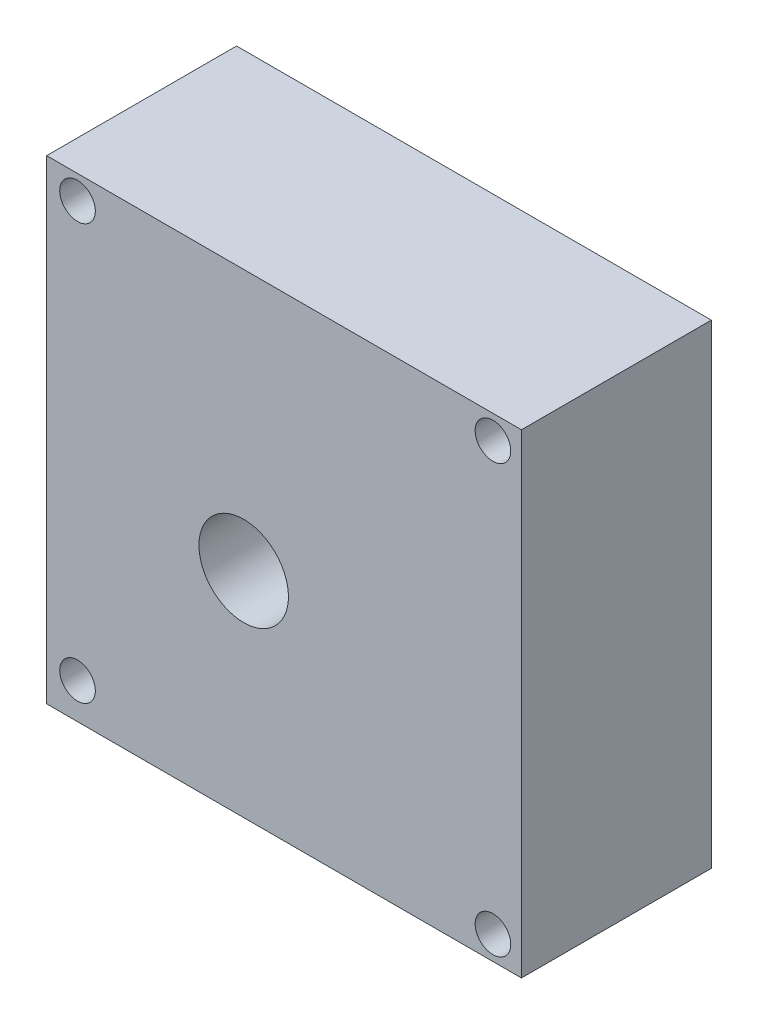
ISO-10303-21;
HEADER;
FILE_DESCRIPTION(('STEP AP214'),'2;1');
FILE_NAME('part.step','',(''),(''),'','','');
FILE_SCHEMA(('AUTOMOTIVE_DESIGN { 1 0 10303 214 1 1 1 1 }'));
ENDSEC;
DATA;
#1=APPLICATION_CONTEXT('core data for automotive mechanical design processes');
#2=APPLICATION_PROTOCOL_DEFINITION('international standard','automotive_design',2000,#1);
#3=PRODUCT_CONTEXT('',#1,'mechanical');
#4=PRODUCT('Part','Part','',(#3));
#5=PRODUCT_RELATED_PRODUCT_CATEGORY('part','',(#4));
#6=PRODUCT_DEFINITION_FORMATION('','',#4);
#7=PRODUCT_DEFINITION_CONTEXT('part definition',#1,'design');
#8=PRODUCT_DEFINITION('design','',#6,#7);
#9=PRODUCT_DEFINITION_SHAPE('','',#8);
#10=(LENGTH_UNIT() NAMED_UNIT(*) SI_UNIT(.MILLI.,.METRE.));
#11=(NAMED_UNIT(*) PLANE_ANGLE_UNIT() SI_UNIT($,.RADIAN.));
#12=(NAMED_UNIT(*) SI_UNIT($,.STERADIAN.) SOLID_ANGLE_UNIT());
#13=UNCERTAINTY_MEASURE_WITH_UNIT(LENGTH_MEASURE(1.E-05),#10,'distance_accuracy_value','');
#14=(GEOMETRIC_REPRESENTATION_CONTEXT(3) GLOBAL_UNCERTAINTY_ASSIGNED_CONTEXT((#13)) GLOBAL_UNIT_ASSIGNED_CONTEXT((#10,
#11,#12)) REPRESENTATION_CONTEXT('',''));
#15=CARTESIAN_POINT('',(0.,0.,0.));
#16=DIRECTION('',(0.,0.,1.));
#17=DIRECTION('',(1.,0.,0.));
#18=AXIS2_PLACEMENT_3D('',#15,#16,#17);
#19=CARTESIAN_POINT('',(0.,0.,0.));
#20=DIRECTION('',(0.,0.,-1.));
#21=DIRECTION('',(-1.,0.,0.));
#22=AXIS2_PLACEMENT_3D('',#19,#20,#21);
#23=PLANE('',#22);
#24=CARTESIAN_POINT('',(47.752,2.54,0.));
#25=DIRECTION('',(0.,0.,-1.));
#26=DIRECTION('',(-1.,0.,0.));
#27=AXIS2_PLACEMENT_3D('',#24,#25,#26);
#28=CIRCLE('',#27,1.905);
#29=CARTESIAN_POINT('',(45.847,2.54,0.));
#30=VERTEX_POINT('',#29);
#31=EDGE_CURVE('E147',#30,#30,#28,.F.);
#32=ORIENTED_EDGE('',*,*,#31,.T.);
#33=EDGE_LOOP('',(#32));
#34=FACE_BOUND('',#33,.T.);
#35=CARTESIAN_POINT('',(3.302,48.26,0.));
#36=DIRECTION('',(0.,0.,-1.));
#37=DIRECTION('',(-1.,0.,0.));
#38=AXIS2_PLACEMENT_3D('',#35,#36,#37);
#39=CIRCLE('',#38,1.905);
#40=CARTESIAN_POINT('',(1.397,48.26,0.));
#41=VERTEX_POINT('',#40);
#42=EDGE_CURVE('E269',#41,#41,#39,.F.);
#43=ORIENTED_EDGE('',*,*,#42,.T.);
#44=EDGE_LOOP('',(#43));
#45=FACE_BOUND('',#44,.T.);
#46=CARTESIAN_POINT('',(3.30199999999999,3.81,0.));
#47=DIRECTION('',(0.,0.,-1.));
#48=DIRECTION('',(-1.,0.,0.));
#49=AXIS2_PLACEMENT_3D('',#46,#47,#48);
#50=CIRCLE('',#49,1.905);
#51=CARTESIAN_POINT('',(1.39699999999999,3.81,0.));
#52=VERTEX_POINT('',#51);
#53=EDGE_CURVE('E267',#52,#52,#50,.F.);
#54=ORIENTED_EDGE('',*,*,#53,.T.);
#55=EDGE_LOOP('',(#54));
#56=FACE_BOUND('',#55,.T.);
#57=CARTESIAN_POINT('',(47.752,48.26,0.));
#58=DIRECTION('',(0.,0.,-1.));
#59=DIRECTION('',(-1.,0.,0.));
#60=AXIS2_PLACEMENT_3D('',#57,#58,#59);
#61=CIRCLE('',#60,1.905);
#62=CARTESIAN_POINT('',(45.847,48.26,0.));
#63=VERTEX_POINT('',#62);
#64=EDGE_CURVE('E264',#63,#63,#61,.F.);
#65=ORIENTED_EDGE('',*,*,#64,.T.);
#66=EDGE_LOOP('',(#65));
#67=FACE_BOUND('',#66,.T.);
#68=DIRECTION('',(0.,-1.,0.));
#69=VECTOR('',#68,1.);
#70=CARTESIAN_POINT('',(0.,0.,0.));
#71=LINE('',#70,#69);
#72=CARTESIAN_POINT('',(0.,50.8,0.));
#73=VERTEX_POINT('',#72);
#74=CARTESIAN_POINT('',(0.,0.,0.));
#75=VERTEX_POINT('',#74);
#76=EDGE_CURVE('E138',#73,#75,#71,.T.);
#77=ORIENTED_EDGE('',*,*,#76,.F.);
#78=DIRECTION('',(-1.,0.,0.));
#79=VECTOR('',#78,1.);
#80=CARTESIAN_POINT('',(0.,50.8,0.));
#81=LINE('',#80,#79);
#82=CARTESIAN_POINT('',(50.8,50.8,0.));
#83=VERTEX_POINT('',#82);
#84=EDGE_CURVE('E86',#83,#73,#81,.T.);
#85=ORIENTED_EDGE('',*,*,#84,.F.);
#86=DIRECTION('',(0.,1.,0.));
#87=VECTOR('',#86,1.);
#88=CARTESIAN_POINT('',(50.8,0.,0.));
#89=LINE('',#88,#87);
#90=CARTESIAN_POINT('',(50.8,0.,0.));
#91=VERTEX_POINT('',#90);
#92=EDGE_CURVE('E169',#91,#83,#89,.T.);
#93=ORIENTED_EDGE('',*,*,#92,.F.);
#94=DIRECTION('',(1.,0.,0.));
#95=VECTOR('',#94,1.);
#96=CARTESIAN_POINT('',(0.,0.,0.));
#97=LINE('',#96,#95);
#98=EDGE_CURVE('E142',#75,#91,#97,.T.);
#99=ORIENTED_EDGE('',*,*,#98,.F.);
#100=EDGE_LOOP('',(#77,#85,#93,#99));
#101=FACE_BOUND('',#100,.T.);
#102=DIRECTION('',(-1.,0.,0.));
#103=VECTOR('',#102,1.);
#104=CARTESIAN_POINT('',(0.,43.18,0.));
#105=LINE('',#104,#103);
#106=CARTESIAN_POINT('',(43.18,43.18,0.));
#107=VERTEX_POINT('',#106);
#108=CARTESIAN_POINT('',(7.62,43.18,0.));
#109=VERTEX_POINT('',#108);
#110=EDGE_CURVE('E133',#107,#109,#105,.T.);
#111=ORIENTED_EDGE('',*,*,#110,.T.);
#112=DIRECTION('',(0.,-1.,0.));
#113=VECTOR('',#112,1.);
#114=CARTESIAN_POINT('',(7.62,0.,0.));
#115=LINE('',#114,#113);
#116=CARTESIAN_POINT('',(7.62,7.62,0.));
#117=VERTEX_POINT('',#116);
#118=EDGE_CURVE('E155',#109,#117,#115,.T.);
#119=ORIENTED_EDGE('',*,*,#118,.T.);
#120=DIRECTION('',(1.,0.,0.));
#121=VECTOR('',#120,1.);
#122=CARTESIAN_POINT('',(0.,7.62,0.));
#123=LINE('',#122,#121);
#124=CARTESIAN_POINT('',(43.18,7.62,0.));
#125=VERTEX_POINT('',#124);
#126=EDGE_CURVE('E137',#117,#125,#123,.T.);
#127=ORIENTED_EDGE('',*,*,#126,.T.);
#128=DIRECTION('',(0.,1.,0.));
#129=VECTOR('',#128,1.);
#130=CARTESIAN_POINT('',(43.18,0.,0.));
#131=LINE('',#130,#129);
#132=EDGE_CURVE('E56',#125,#107,#131,.T.);
#133=ORIENTED_EDGE('',*,*,#132,.T.);
#134=EDGE_LOOP('',(#111,#119,#127,#133));
#135=FACE_BOUND('',#134,.T.);
#136=ADVANCED_FACE('F41',(#34,#45,#56,#67,#101,#135),#23,.T.);
#137=CARTESIAN_POINT('',(0.,0.,20.32));
#138=DIRECTION('',(1.,0.,0.));
#139=DIRECTION('',(0.,0.,-1.));
#140=AXIS2_PLACEMENT_3D('',#137,#138,#139);
#141=PLANE('',#140);
#142=ORIENTED_EDGE('',*,*,#76,.T.);
#143=DIRECTION('',(0.,0.,-1.));
#144=VECTOR('',#143,1.);
#145=CARTESIAN_POINT('',(0.,0.,20.32));
#146=LINE('',#145,#144);
#147=CARTESIAN_POINT('',(0.,0.,20.32));
#148=VERTEX_POINT('',#147);
#149=EDGE_CURVE('E11',#148,#75,#146,.T.);
#150=ORIENTED_EDGE('',*,*,#149,.F.);
#151=DIRECTION('',(0.,-1.,0.));
#152=VECTOR('',#151,1.);
#153=CARTESIAN_POINT('',(0.,0.,20.32));
#154=LINE('',#153,#152);
#155=CARTESIAN_POINT('',(0.,50.8,20.32));
#156=VERTEX_POINT('',#155);
#157=EDGE_CURVE('E161',#156,#148,#154,.T.);
#158=ORIENTED_EDGE('',*,*,#157,.F.);
#159=DIRECTION('',(0.,0.,-1.));
#160=VECTOR('',#159,1.);
#161=CARTESIAN_POINT('',(0.,50.8,20.32));
#162=LINE('',#161,#160);
#163=EDGE_CURVE('E166',#156,#73,#162,.T.);
#164=ORIENTED_EDGE('',*,*,#163,.T.);
#165=EDGE_LOOP('',(#142,#150,#158,#164));
#166=FACE_BOUND('',#165,.T.);
#167=ADVANCED_FACE('F43',(#166),#141,.F.);
#168=CARTESIAN_POINT('',(0.,0.,20.32));
#169=DIRECTION('',(0.,1.,0.));
#170=DIRECTION('',(0.,0.,1.));
#171=AXIS2_PLACEMENT_3D('',#168,#169,#170);
#172=PLANE('',#171);
#173=ORIENTED_EDGE('',*,*,#98,.T.);
#174=DIRECTION('',(0.,0.,-1.));
#175=VECTOR('',#174,1.);
#176=CARTESIAN_POINT('',(50.8,0.,20.32));
#177=LINE('',#176,#175);
#178=CARTESIAN_POINT('',(50.8,0.,20.32));
#179=VERTEX_POINT('',#178);
#180=EDGE_CURVE('E49',#179,#91,#177,.T.);
#181=ORIENTED_EDGE('',*,*,#180,.F.);
#182=DIRECTION('',(1.,0.,0.));
#183=VECTOR('',#182,1.);
#184=CARTESIAN_POINT('',(0.,0.,20.32));
#185=LINE('',#184,#183);
#186=EDGE_CURVE('E93',#148,#179,#185,.T.);
#187=ORIENTED_EDGE('',*,*,#186,.F.);
#188=ORIENTED_EDGE('',*,*,#149,.T.);
#189=EDGE_LOOP('',(#173,#181,#187,#188));
#190=FACE_BOUND('',#189,.T.);
#191=ADVANCED_FACE('F197',(#190),#172,.F.);
#192=CARTESIAN_POINT('',(50.8,0.,20.32));
#193=DIRECTION('',(-1.,0.,0.));
#194=DIRECTION('',(0.,0.,1.));
#195=AXIS2_PLACEMENT_3D('',#192,#193,#194);
#196=PLANE('',#195);
#197=ORIENTED_EDGE('',*,*,#92,.T.);
#198=DIRECTION('',(0.,0.,-1.));
#199=VECTOR('',#198,1.);
#200=CARTESIAN_POINT('',(50.8,50.8,20.32));
#201=LINE('',#200,#199);
#202=CARTESIAN_POINT('',(50.8,50.8,20.32));
#203=VERTEX_POINT('',#202);
#204=EDGE_CURVE('E173',#203,#83,#201,.T.);
#205=ORIENTED_EDGE('',*,*,#204,.F.);
#206=DIRECTION('',(0.,1.,0.));
#207=VECTOR('',#206,1.);
#208=CARTESIAN_POINT('',(50.8,0.,20.32));
#209=LINE('',#208,#207);
#210=EDGE_CURVE('E164',#179,#203,#209,.T.);
#211=ORIENTED_EDGE('',*,*,#210,.F.);
#212=ORIENTED_EDGE('',*,*,#180,.T.);
#213=EDGE_LOOP('',(#197,#205,#211,#212));
#214=FACE_BOUND('',#213,.T.);
#215=ADVANCED_FACE('F178',(#214),#196,.F.);
#216=CARTESIAN_POINT('',(0.,50.8,20.32));
#217=DIRECTION('',(0.,-1.,0.));
#218=DIRECTION('',(0.,0.,-1.));
#219=AXIS2_PLACEMENT_3D('',#216,#217,#218);
#220=PLANE('',#219);
#221=ORIENTED_EDGE('',*,*,#84,.T.);
#222=ORIENTED_EDGE('',*,*,#163,.F.);
#223=DIRECTION('',(-1.,0.,0.));
#224=VECTOR('',#223,1.);
#225=CARTESIAN_POINT('',(0.,50.8,20.32));
#226=LINE('',#225,#224);
#227=EDGE_CURVE('E65',#203,#156,#226,.T.);
#228=ORIENTED_EDGE('',*,*,#227,.F.);
#229=ORIENTED_EDGE('',*,*,#204,.T.);
#230=EDGE_LOOP('',(#221,#222,#228,#229));
#231=FACE_BOUND('',#230,.T.);
#232=ADVANCED_FACE('F186',(#231),#220,.F.);
#233=CARTESIAN_POINT('',(0.,0.,20.32));
#234=DIRECTION('',(0.,0.,-1.));
#235=DIRECTION('',(-1.,0.,0.));
#236=AXIS2_PLACEMENT_3D('',#233,#234,#235);
#237=PLANE('',#236);
#238=CARTESIAN_POINT('',(21.082,22.86,20.32));
#239=DIRECTION('',(0.,0.,-1.));
#240=DIRECTION('',(-1.,0.,0.));
#241=AXIS2_PLACEMENT_3D('',#238,#239,#240);
#242=CIRCLE('',#241,4.7879);
#243=CARTESIAN_POINT('',(16.2941,22.86,20.32));
#244=VERTEX_POINT('',#243);
#245=EDGE_CURVE('E245',#244,#244,#242,.T.);
#246=ORIENTED_EDGE('',*,*,#245,.T.);
#247=EDGE_LOOP('',(#246));
#248=FACE_BOUND('',#247,.T.);
#249=CARTESIAN_POINT('',(47.752,2.54,20.32));
#250=DIRECTION('',(0.,0.,-1.));
#251=DIRECTION('',(-1.,0.,0.));
#252=AXIS2_PLACEMENT_3D('',#249,#250,#251);
#253=CIRCLE('',#252,1.905);
#254=CARTESIAN_POINT('',(45.847,2.54,20.32));
#255=VERTEX_POINT('',#254);
#256=EDGE_CURVE('E256',#255,#255,#253,.T.);
#257=ORIENTED_EDGE('',*,*,#256,.T.);
#258=EDGE_LOOP('',(#257));
#259=FACE_BOUND('',#258,.T.);
#260=CARTESIAN_POINT('',(3.302,48.26,20.32));
#261=DIRECTION('',(0.,0.,-1.));
#262=DIRECTION('',(-1.,0.,0.));
#263=AXIS2_PLACEMENT_3D('',#260,#261,#262);
#264=CIRCLE('',#263,1.905);
#265=CARTESIAN_POINT('',(1.397,48.26,20.32));
#266=VERTEX_POINT('',#265);
#267=EDGE_CURVE('E255',#266,#266,#264,.T.);
#268=ORIENTED_EDGE('',*,*,#267,.T.);
#269=EDGE_LOOP('',(#268));
#270=FACE_BOUND('',#269,.T.);
#271=CARTESIAN_POINT('',(3.30199999999999,3.81,20.32));
#272=DIRECTION('',(0.,0.,-1.));
#273=DIRECTION('',(-1.,0.,0.));
#274=AXIS2_PLACEMENT_3D('',#271,#272,#273);
#275=CIRCLE('',#274,1.905);
#276=CARTESIAN_POINT('',(1.39699999999999,3.81,20.32));
#277=VERTEX_POINT('',#276);
#278=EDGE_CURVE('E250',#277,#277,#275,.T.);
#279=ORIENTED_EDGE('',*,*,#278,.T.);
#280=EDGE_LOOP('',(#279));
#281=FACE_BOUND('',#280,.T.);
#282=CARTESIAN_POINT('',(47.752,48.26,20.32));
#283=DIRECTION('',(0.,0.,-1.));
#284=DIRECTION('',(-1.,0.,0.));
#285=AXIS2_PLACEMENT_3D('',#282,#283,#284);
#286=CIRCLE('',#285,1.905);
#287=CARTESIAN_POINT('',(45.847,48.26,20.32));
#288=VERTEX_POINT('',#287);
#289=EDGE_CURVE('E259',#288,#288,#286,.T.);
#290=ORIENTED_EDGE('',*,*,#289,.T.);
#291=EDGE_LOOP('',(#290));
#292=FACE_BOUND('',#291,.T.);
#293=ORIENTED_EDGE('',*,*,#157,.T.);
#294=ORIENTED_EDGE('',*,*,#186,.T.);
#295=ORIENTED_EDGE('',*,*,#210,.T.);
#296=ORIENTED_EDGE('',*,*,#227,.T.);
#297=EDGE_LOOP('',(#293,#294,#295,#296));
#298=FACE_BOUND('',#297,.T.);
#299=ADVANCED_FACE('F188',(#248,#259,#270,#281,#292,#298),#237,.F.);
#300=CARTESIAN_POINT('',(7.62,0.,20.32));
#301=DIRECTION('',(1.,0.,0.));
#302=DIRECTION('',(0.,0.,-1.));
#303=AXIS2_PLACEMENT_3D('',#300,#301,#302);
#304=PLANE('',#303);
#305=ORIENTED_EDGE('',*,*,#118,.F.);
#306=DIRECTION('',(0.,0.,-1.));
#307=VECTOR('',#306,1.);
#308=CARTESIAN_POINT('',(7.62,43.18,20.32));
#309=LINE('',#308,#307);
#310=CARTESIAN_POINT('',(7.62,43.18,12.7));
#311=VERTEX_POINT('',#310);
#312=EDGE_CURVE('E132',#311,#109,#309,.T.);
#313=ORIENTED_EDGE('',*,*,#312,.F.);
#314=DIRECTION('',(0.,-1.,0.));
#315=VECTOR('',#314,1.);
#316=CARTESIAN_POINT('',(7.62,0.,12.7));
#317=LINE('',#316,#315);
#318=CARTESIAN_POINT('',(7.62,7.62,12.7));
#319=VERTEX_POINT('',#318);
#320=EDGE_CURVE('E120',#311,#319,#317,.T.);
#321=ORIENTED_EDGE('',*,*,#320,.T.);
#322=DIRECTION('',(0.,0.,-1.));
#323=VECTOR('',#322,1.);
#324=CARTESIAN_POINT('',(7.62,7.62,20.32));
#325=LINE('',#324,#323);
#326=EDGE_CURVE('E130',#319,#117,#325,.T.);
#327=ORIENTED_EDGE('',*,*,#326,.T.);
#328=EDGE_LOOP('',(#305,#313,#321,#327));
#329=FACE_BOUND('',#328,.T.);
#330=ADVANCED_FACE('F129',(#329),#304,.T.);
#331=CARTESIAN_POINT('',(0.,7.62,20.32));
#332=DIRECTION('',(0.,1.,0.));
#333=DIRECTION('',(0.,0.,1.));
#334=AXIS2_PLACEMENT_3D('',#331,#332,#333);
#335=PLANE('',#334);
#336=ORIENTED_EDGE('',*,*,#126,.F.);
#337=ORIENTED_EDGE('',*,*,#326,.F.);
#338=DIRECTION('',(1.,0.,0.));
#339=VECTOR('',#338,1.);
#340=CARTESIAN_POINT('',(0.,7.62,12.7));
#341=LINE('',#340,#339);
#342=CARTESIAN_POINT('',(43.18,7.62,12.7));
#343=VERTEX_POINT('',#342);
#344=EDGE_CURVE('E116',#319,#343,#341,.T.);
#345=ORIENTED_EDGE('',*,*,#344,.T.);
#346=DIRECTION('',(0.,0.,-1.));
#347=VECTOR('',#346,1.);
#348=CARTESIAN_POINT('',(43.18,7.62,20.32));
#349=LINE('',#348,#347);
#350=EDGE_CURVE('E139',#343,#125,#349,.T.);
#351=ORIENTED_EDGE('',*,*,#350,.T.);
#352=EDGE_LOOP('',(#336,#337,#345,#351));
#353=FACE_BOUND('',#352,.T.);
#354=ADVANCED_FACE('F135',(#353),#335,.T.);
#355=CARTESIAN_POINT('',(43.18,0.,20.32));
#356=DIRECTION('',(-1.,0.,0.));
#357=DIRECTION('',(0.,0.,1.));
#358=AXIS2_PLACEMENT_3D('',#355,#356,#357);
#359=PLANE('',#358);
#360=ORIENTED_EDGE('',*,*,#132,.F.);
#361=ORIENTED_EDGE('',*,*,#350,.F.);
#362=DIRECTION('',(0.,1.,0.));
#363=VECTOR('',#362,1.);
#364=CARTESIAN_POINT('',(43.18,0.,12.7));
#365=LINE('',#364,#363);
#366=CARTESIAN_POINT('',(43.18,43.18,12.7));
#367=VERTEX_POINT('',#366);
#368=EDGE_CURVE('E121',#343,#367,#365,.T.);
#369=ORIENTED_EDGE('',*,*,#368,.T.);
#370=DIRECTION('',(0.,0.,-1.));
#371=VECTOR('',#370,1.);
#372=CARTESIAN_POINT('',(43.18,43.18,20.32));
#373=LINE('',#372,#371);
#374=EDGE_CURVE('E144',#367,#107,#373,.T.);
#375=ORIENTED_EDGE('',*,*,#374,.T.);
#376=EDGE_LOOP('',(#360,#361,#369,#375));
#377=FACE_BOUND('',#376,.T.);
#378=ADVANCED_FACE('F216',(#377),#359,.T.);
#379=CARTESIAN_POINT('',(0.,43.18,20.32));
#380=DIRECTION('',(0.,-1.,0.));
#381=DIRECTION('',(0.,0.,-1.));
#382=AXIS2_PLACEMENT_3D('',#379,#380,#381);
#383=PLANE('',#382);
#384=ORIENTED_EDGE('',*,*,#110,.F.);
#385=ORIENTED_EDGE('',*,*,#374,.F.);
#386=DIRECTION('',(-1.,0.,0.));
#387=VECTOR('',#386,1.);
#388=CARTESIAN_POINT('',(0.,43.18,12.7));
#389=LINE('',#388,#387);
#390=EDGE_CURVE('E150',#367,#311,#389,.T.);
#391=ORIENTED_EDGE('',*,*,#390,.T.);
#392=ORIENTED_EDGE('',*,*,#312,.T.);
#393=EDGE_LOOP('',(#384,#385,#391,#392));
#394=FACE_BOUND('',#393,.T.);
#395=ADVANCED_FACE('F213',(#394),#383,.T.);
#396=CARTESIAN_POINT('',(0.,0.,12.7));
#397=DIRECTION('',(0.,0.,-1.));
#398=DIRECTION('',(-1.,0.,0.));
#399=AXIS2_PLACEMENT_3D('',#396,#397,#398);
#400=PLANE('',#399);
#401=CARTESIAN_POINT('',(21.082,22.86,12.7));
#402=DIRECTION('',(0.,0.,-1.));
#403=DIRECTION('',(-1.,0.,0.));
#404=AXIS2_PLACEMENT_3D('',#401,#402,#403);
#405=CIRCLE('',#404,4.7879);
#406=CARTESIAN_POINT('',(16.2941,22.86,12.7));
#407=VERTEX_POINT('',#406);
#408=EDGE_CURVE('E248',#407,#407,#405,.T.);
#409=ORIENTED_EDGE('',*,*,#408,.F.);
#410=EDGE_LOOP('',(#409));
#411=FACE_BOUND('',#410,.T.);
#412=ORIENTED_EDGE('',*,*,#320,.F.);
#413=ORIENTED_EDGE('',*,*,#390,.F.);
#414=ORIENTED_EDGE('',*,*,#368,.F.);
#415=ORIENTED_EDGE('',*,*,#344,.F.);
#416=EDGE_LOOP('',(#412,#413,#414,#415));
#417=FACE_BOUND('',#416,.T.);
#418=ADVANCED_FACE('F118',(#411,#417),#400,.T.);
#419=CARTESIAN_POINT('',(47.752,48.26,-7.36599999999999));
#420=DIRECTION('',(0.,0.,1.));
#421=DIRECTION('',(1.,0.,0.));
#422=AXIS2_PLACEMENT_3D('',#419,#420,#421);
#423=CYLINDRICAL_SURFACE('',#422,1.905);
#424=ORIENTED_EDGE('',*,*,#64,.F.);
#425=EDGE_LOOP('',(#424));
#426=FACE_BOUND('',#425,.T.);
#427=ORIENTED_EDGE('',*,*,#289,.F.);
#428=EDGE_LOOP('',(#427));
#429=FACE_BOUND('',#428,.T.);
#430=ADVANCED_FACE('F212',(#426,#429),#423,.F.);
#431=CARTESIAN_POINT('',(3.30199999999999,3.81,-7.36599999999999));
#432=DIRECTION('',(0.,0.,1.));
#433=DIRECTION('',(1.,0.,0.));
#434=AXIS2_PLACEMENT_3D('',#431,#432,#433);
#435=CYLINDRICAL_SURFACE('',#434,1.905);
#436=ORIENTED_EDGE('',*,*,#53,.F.);
#437=EDGE_LOOP('',(#436));
#438=FACE_BOUND('',#437,.T.);
#439=ORIENTED_EDGE('',*,*,#278,.F.);
#440=EDGE_LOOP('',(#439));
#441=FACE_BOUND('',#440,.T.);
#442=ADVANCED_FACE('F224',(#438,#441),#435,.F.);
#443=CARTESIAN_POINT('',(3.302,48.26,-7.36599999999999));
#444=DIRECTION('',(0.,0.,1.));
#445=DIRECTION('',(1.,0.,0.));
#446=AXIS2_PLACEMENT_3D('',#443,#444,#445);
#447=CYLINDRICAL_SURFACE('',#446,1.905);
#448=ORIENTED_EDGE('',*,*,#42,.F.);
#449=EDGE_LOOP('',(#448));
#450=FACE_BOUND('',#449,.T.);
#451=ORIENTED_EDGE('',*,*,#267,.F.);
#452=EDGE_LOOP('',(#451));
#453=FACE_BOUND('',#452,.T.);
#454=ADVANCED_FACE('F226',(#450,#453),#447,.F.);
#455=CARTESIAN_POINT('',(47.752,2.54,-7.36599999999999));
#456=DIRECTION('',(0.,0.,1.));
#457=DIRECTION('',(1.,0.,0.));
#458=AXIS2_PLACEMENT_3D('',#455,#456,#457);
#459=CYLINDRICAL_SURFACE('',#458,1.905);
#460=ORIENTED_EDGE('',*,*,#31,.F.);
#461=EDGE_LOOP('',(#460));
#462=FACE_BOUND('',#461,.T.);
#463=ORIENTED_EDGE('',*,*,#256,.F.);
#464=EDGE_LOOP('',(#463));
#465=FACE_BOUND('',#464,.T.);
#466=ADVANCED_FACE('F229',(#462,#465),#459,.F.);
#467=CARTESIAN_POINT('',(21.082,22.86,20.32));
#468=DIRECTION('',(0.,0.,-1.));
#469=DIRECTION('',(-1.,0.,0.));
#470=AXIS2_PLACEMENT_3D('',#467,#468,#469);
#471=CYLINDRICAL_SURFACE('',#470,4.7879);
#472=CARTESIAN_POINT('',(16.2941,22.86,20.32));
#473=CARTESIAN_POINT('',(16.2941,22.86,20.240625));
#474=CARTESIAN_POINT('',(16.2941,22.86,20.16125));
#475=CARTESIAN_POINT('',(16.2941,22.86,20.0025));
#476=CARTESIAN_POINT('',(16.2941,22.86,19.923125));
#477=CARTESIAN_POINT('',(16.2941,22.86,19.764375));
#478=CARTESIAN_POINT('',(16.2941,22.86,19.685));
#479=CARTESIAN_POINT('',(16.2941,22.86,19.52625));
#480=CARTESIAN_POINT('',(16.2941,22.86,19.446875));
#481=CARTESIAN_POINT('',(16.2941,22.86,19.288125));
#482=CARTESIAN_POINT('',(16.2941,22.86,19.20875));
#483=CARTESIAN_POINT('',(16.2941,22.86,19.05));
#484=CARTESIAN_POINT('',(16.2941,22.86,18.970625));
#485=CARTESIAN_POINT('',(16.2941,22.86,18.811875));
#486=CARTESIAN_POINT('',(16.2941,22.86,18.7325));
#487=CARTESIAN_POINT('',(16.2941,22.86,18.57375));
#488=CARTESIAN_POINT('',(16.2941,22.86,18.494375));
#489=CARTESIAN_POINT('',(16.2941,22.86,18.335625));
#490=CARTESIAN_POINT('',(16.2941,22.86,18.25625));
#491=CARTESIAN_POINT('',(16.2941,22.86,18.0975));
#492=CARTESIAN_POINT('',(16.2941,22.86,18.018125));
#493=CARTESIAN_POINT('',(16.2941,22.86,17.859375));
#494=CARTESIAN_POINT('',(16.2941,22.86,17.78));
#495=CARTESIAN_POINT('',(16.2941,22.86,17.62125));
#496=CARTESIAN_POINT('',(16.2941,22.86,17.541875));
#497=CARTESIAN_POINT('',(16.2941,22.86,17.383125));
#498=CARTESIAN_POINT('',(16.2941,22.86,17.30375));
#499=CARTESIAN_POINT('',(16.2941,22.86,17.145));
#500=CARTESIAN_POINT('',(16.2941,22.86,17.065625));
#501=CARTESIAN_POINT('',(16.2941,22.86,16.906875));
#502=CARTESIAN_POINT('',(16.2941,22.86,16.8275));
#503=CARTESIAN_POINT('',(16.2941,22.86,16.66875));
#504=CARTESIAN_POINT('',(16.2941,22.86,16.589375));
#505=CARTESIAN_POINT('',(16.2941,22.86,16.430625));
#506=CARTESIAN_POINT('',(16.2941,22.86,16.35125));
#507=CARTESIAN_POINT('',(16.2941,22.86,16.1925));
#508=CARTESIAN_POINT('',(16.2941,22.86,16.113125));
#509=CARTESIAN_POINT('',(16.2941,22.86,15.954375));
#510=CARTESIAN_POINT('',(16.2941,22.86,15.875));
#511=CARTESIAN_POINT('',(16.2941,22.86,15.71625));
#512=CARTESIAN_POINT('',(16.2941,22.86,15.636875));
#513=CARTESIAN_POINT('',(16.2941,22.86,15.478125));
#514=CARTESIAN_POINT('',(16.2941,22.86,15.39875));
#515=CARTESIAN_POINT('',(16.2941,22.86,15.24));
#516=CARTESIAN_POINT('',(16.2941,22.86,15.160625));
#517=CARTESIAN_POINT('',(16.2941,22.86,15.001875));
#518=CARTESIAN_POINT('',(16.2941,22.86,14.9225));
#519=CARTESIAN_POINT('',(16.2941,22.86,14.76375));
#520=CARTESIAN_POINT('',(16.2941,22.86,14.684375));
#521=CARTESIAN_POINT('',(16.2941,22.86,14.525625));
#522=CARTESIAN_POINT('',(16.2941,22.86,14.44625));
#523=CARTESIAN_POINT('',(16.2941,22.86,14.2875));
#524=CARTESIAN_POINT('',(16.2941,22.86,14.208125));
#525=CARTESIAN_POINT('',(16.2941,22.86,14.049375));
#526=CARTESIAN_POINT('',(16.2941,22.86,13.97));
#527=CARTESIAN_POINT('',(16.2941,22.86,13.81125));
#528=CARTESIAN_POINT('',(16.2941,22.86,13.731875));
#529=CARTESIAN_POINT('',(16.2941,22.86,13.573125));
#530=CARTESIAN_POINT('',(16.2941,22.86,13.49375));
#531=CARTESIAN_POINT('',(16.2941,22.86,13.335));
#532=CARTESIAN_POINT('',(16.2941,22.86,13.255625));
#533=CARTESIAN_POINT('',(16.2941,22.86,13.096875));
#534=CARTESIAN_POINT('',(16.2941,22.86,13.0175));
#535=CARTESIAN_POINT('',(16.2941,22.86,12.85875));
#536=CARTESIAN_POINT('',(16.2941,22.86,12.779375));
#537=CARTESIAN_POINT('',(16.2941,22.86,12.7));
#538=B_SPLINE_CURVE_WITH_KNOTS('',3,(#472,#473,#474,#475,#476,#477,#478,#479,#480,#481,#482,
#483,#484,#485,#486,#487,#488,#489,#490,#491,#492,#493,#494,#495,#496,#497,#498,#499,#500,#501,
#502,#503,#504,#505,#506,#507,#508,#509,#510,#511,#512,#513,#514,#515,#516,#517,#518,#519,#520,
#521,#522,#523,#524,#525,#526,#527,#528,#529,#530,#531,#532,#533,#534,#535,#536,#537),
.UNSPECIFIED.,.F.,.F.,(4,2,2,2,2,2,2,2,2,2,2,2,2,2,2,2,2,2,2,2,2,2,2,2,2,2,2,2,2,2,2,2,4),(0.,
0.238124999999999,0.476249999999998,0.714375,0.952499999999998,1.190625,1.42875,1.666875,1.905,
2.143125,2.38125,2.619375,2.8575,3.095625,3.33375,3.571875,3.81,4.048125,4.28625,4.524375,
4.7625,5.000625,5.23875,5.476875,5.715,5.953125,6.19125,6.429375,6.6675,6.905625,7.14375,
7.381875,7.62),.UNSPECIFIED.);
#539=EDGE_CURVE('BSEAM233',#244,#407,#538,.T.);
#540=ORIENTED_EDGE('',*,*,#245,.F.);
#541=ORIENTED_EDGE('',*,*,#408,.T.);
#542=ORIENTED_EDGE('',*,*,#539,.T.);
#543=ORIENTED_EDGE('',*,*,#539,.F.);
#544=EDGE_LOOP('',(#540,#542,#541,#543));
#545=FACE_BOUND('',#544,.T.);
#546=ADVANCED_FACE('F233',(#545),#471,.F.);
#547=CLOSED_SHELL('',(#136,#167,#191,#215,#232,#299,#330,#354,#378,#395,#418,#430,#442,#454,
#466,#546));
#548=MANIFOLD_SOLID_BREP('B2',#547);
#549=ADVANCED_BREP_SHAPE_REPRESENTATION('',(#18,#548),#14);
#550=SHAPE_DEFINITION_REPRESENTATION(#9,#549);
ENDSEC;
END-ISO-10303-21;
